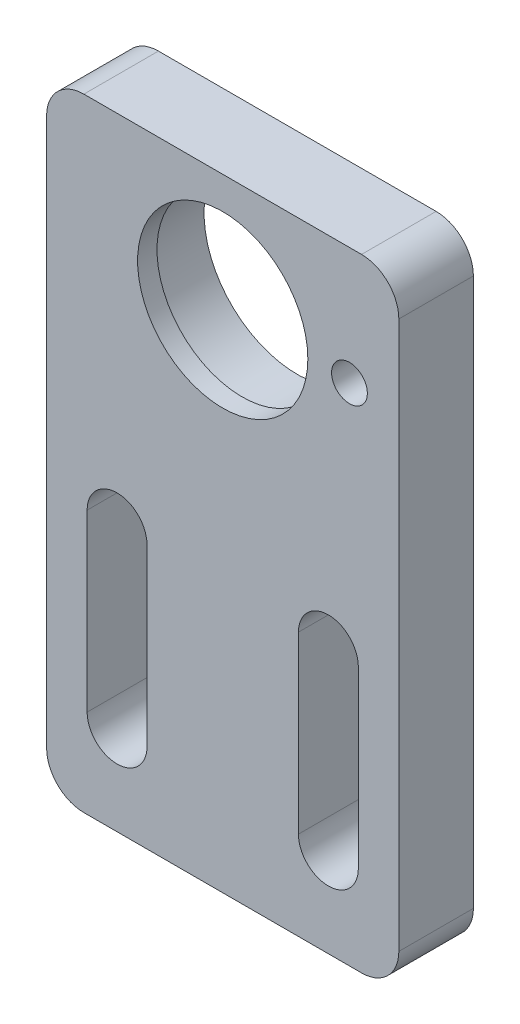
ISO-10303-21;
HEADER;
FILE_DESCRIPTION(('STEP AP214'),'2;1');
FILE_NAME('part.step','',(''),(''),'','','');
FILE_SCHEMA(('AUTOMOTIVE_DESIGN { 1 0 10303 214 1 1 1 1 }'));
ENDSEC;
DATA;
#1=APPLICATION_CONTEXT('core data for automotive mechanical design processes');
#2=APPLICATION_PROTOCOL_DEFINITION('international standard','automotive_design',2000,#1);
#3=PRODUCT_CONTEXT('',#1,'mechanical');
#4=PRODUCT('Part','Part','',(#3));
#5=PRODUCT_RELATED_PRODUCT_CATEGORY('part','',(#4));
#6=PRODUCT_DEFINITION_FORMATION('','',#4);
#7=PRODUCT_DEFINITION_CONTEXT('part definition',#1,'design');
#8=PRODUCT_DEFINITION('design','',#6,#7);
#9=PRODUCT_DEFINITION_SHAPE('','',#8);
#10=(LENGTH_UNIT() NAMED_UNIT(*) SI_UNIT(.MILLI.,.METRE.));
#11=(NAMED_UNIT(*) PLANE_ANGLE_UNIT() SI_UNIT($,.RADIAN.));
#12=(NAMED_UNIT(*) SI_UNIT($,.STERADIAN.) SOLID_ANGLE_UNIT());
#13=UNCERTAINTY_MEASURE_WITH_UNIT(LENGTH_MEASURE(1.E-05),#10,'distance_accuracy_value','');
#14=(GEOMETRIC_REPRESENTATION_CONTEXT(3) GLOBAL_UNCERTAINTY_ASSIGNED_CONTEXT((#13)) GLOBAL_UNIT_ASSIGNED_CONTEXT((#10,
#11,#12)) REPRESENTATION_CONTEXT('',''));
#15=CARTESIAN_POINT('',(0.,0.,0.));
#16=DIRECTION('',(0.,0.,1.));
#17=DIRECTION('',(1.,0.,0.));
#18=AXIS2_PLACEMENT_3D('',#15,#16,#17);
#19=CARTESIAN_POINT('',(375.68370158766,219.772136265731,0.));
#20=DIRECTION('',(0.,0.,1.));
#21=DIRECTION('',(1.,0.,0.));
#22=AXIS2_PLACEMENT_3D('',#19,#20,#21);
#23=PLANE('',#22);
#24=DIRECTION('',(-1.,0.,0.));
#25=VECTOR('',#24,1.);
#26=CARTESIAN_POINT('',(375.68370158766,293.78385422436,0.));
#27=LINE('',#26,#25);
#28=CARTESIAN_POINT('',(387.5087015876,293.78385422436,0.));
#29=VERTEX_POINT('',#28);
#30=CARTESIAN_POINT('',(363.85870158772,293.78385422436,0.));
#31=VERTEX_POINT('',#30);
#32=EDGE_CURVE('E211',#29,#31,#27,.T.);
#33=ORIENTED_EDGE('',*,*,#32,.F.);
#34=CARTESIAN_POINT('',(387.5087015876,290.60885422436,0.));
#35=DIRECTION('',(0.,0.,1.));
#36=DIRECTION('',(1.,0.,0.));
#37=AXIS2_PLACEMENT_3D('',#34,#35,#36);
#38=CIRCLE('',#37,3.17499999999998);
#39=CARTESIAN_POINT('',(390.6837015876,290.60885422436,0.));
#40=VERTEX_POINT('',#39);
#41=EDGE_CURVE('E109',#40,#29,#38,.T.);
#42=ORIENTED_EDGE('',*,*,#41,.F.);
#43=DIRECTION('',(0.,1.,0.));
#44=VECTOR('',#43,1.);
#45=CARTESIAN_POINT('',(390.6837015876,219.772136265731,0.));
#46=LINE('',#45,#44);
#47=CARTESIAN_POINT('',(390.6837015876,243.95885422254,0.));
#48=VERTEX_POINT('',#47);
#49=EDGE_CURVE('E103',#48,#40,#46,.T.);
#50=ORIENTED_EDGE('',*,*,#49,.F.);
#51=CARTESIAN_POINT('',(387.5087015876,243.95885422254,0.));
#52=DIRECTION('',(0.,0.,1.));
#53=DIRECTION('',(1.,0.,0.));
#54=AXIS2_PLACEMENT_3D('',#51,#52,#53);
#55=CIRCLE('',#54,3.175);
#56=CARTESIAN_POINT('',(387.5087015876,240.78385422254,0.));
#57=VERTEX_POINT('',#56);
#58=EDGE_CURVE('E170',#57,#48,#55,.T.);
#59=ORIENTED_EDGE('',*,*,#58,.F.);
#60=DIRECTION('',(1.,0.,0.));
#61=VECTOR('',#60,1.);
#62=CARTESIAN_POINT('',(375.68370158766,240.78385422254,0.));
#63=LINE('',#62,#61);
#64=CARTESIAN_POINT('',(363.85870158772,240.78385422254,0.));
#65=VERTEX_POINT('',#64);
#66=EDGE_CURVE('E220',#65,#57,#63,.T.);
#67=ORIENTED_EDGE('',*,*,#66,.F.);
#68=CARTESIAN_POINT('',(363.85870158772,243.95885422254,0.));
#69=DIRECTION('',(0.,0.,1.));
#70=DIRECTION('',(1.,0.,0.));
#71=AXIS2_PLACEMENT_3D('',#68,#69,#70);
#72=CIRCLE('',#71,3.17500000000003);
#73=CARTESIAN_POINT('',(360.68370158772,243.95885422254,0.));
#74=VERTEX_POINT('',#73);
#75=EDGE_CURVE('E218',#74,#65,#72,.T.);
#76=ORIENTED_EDGE('',*,*,#75,.F.);
#77=DIRECTION('',(0.,-1.,0.));
#78=VECTOR('',#77,1.);
#79=CARTESIAN_POINT('',(360.68370158772,219.772136265731,0.));
#80=LINE('',#79,#78);
#81=CARTESIAN_POINT('',(360.68370158772,290.60885422436,0.));
#82=VERTEX_POINT('',#81);
#83=EDGE_CURVE('E216',#82,#74,#80,.T.);
#84=ORIENTED_EDGE('',*,*,#83,.F.);
#85=CARTESIAN_POINT('',(363.85870158772,290.60885422436,0.));
#86=DIRECTION('',(0.,0.,1.));
#87=DIRECTION('',(1.,0.,0.));
#88=AXIS2_PLACEMENT_3D('',#85,#86,#87);
#89=CIRCLE('',#88,3.17500000000001);
#90=EDGE_CURVE('E214',#31,#82,#89,.T.);
#91=ORIENTED_EDGE('',*,*,#90,.F.);
#92=EDGE_LOOP('',(#33,#42,#50,#59,#67,#76,#84,#91));
#93=FACE_BOUND('',#92,.T.);
#94=CARTESIAN_POINT('',(366.68370158795,263.23385422466,0.));
#95=DIRECTION('',(0.,0.,1.));
#96=DIRECTION('',(1.,0.,0.));
#97=AXIS2_PLACEMENT_3D('',#94,#95,#96);
#98=CIRCLE('',#97,2.54999999904998);
#99=CARTESIAN_POINT('',(369.233701587,263.23385422466,0.));
#100=VERTEX_POINT('',#99);
#101=CARTESIAN_POINT('',(364.1337015889,263.23385422466,0.));
#102=VERTEX_POINT('',#101);
#103=EDGE_CURVE('E199',#100,#102,#98,.T.);
#104=ORIENTED_EDGE('',*,*,#103,.T.);
#105=DIRECTION('',(0.,1.,0.));
#106=VECTOR('',#105,1.);
#107=CARTESIAN_POINT('',(364.1337015889,219.772136265731,0.));
#108=LINE('',#107,#106);
#109=CARTESIAN_POINT('',(364.1337015889,248.33385422284,0.));
#110=VERTEX_POINT('',#109);
#111=EDGE_CURVE('E208',#110,#102,#108,.T.);
#112=ORIENTED_EDGE('',*,*,#111,.F.);
#113=CARTESIAN_POINT('',(366.68370158795,248.33385422284,0.));
#114=DIRECTION('',(0.,0.,1.));
#115=DIRECTION('',(1.,0.,0.));
#116=AXIS2_PLACEMENT_3D('',#113,#114,#115);
#117=CIRCLE('',#116,2.54999999904998);
#118=CARTESIAN_POINT('',(369.233701587,248.33385422284,0.));
#119=VERTEX_POINT('',#118);
#120=EDGE_CURVE('E205',#110,#119,#117,.T.);
#121=ORIENTED_EDGE('',*,*,#120,.T.);
#122=DIRECTION('',(0.,-1.,0.));
#123=VECTOR('',#122,1.);
#124=CARTESIAN_POINT('',(369.233701587,219.772136265731,0.));
#125=LINE('',#124,#123);
#126=EDGE_CURVE('E202',#100,#119,#125,.T.);
#127=ORIENTED_EDGE('',*,*,#126,.F.);
#128=EDGE_LOOP('',(#104,#112,#121,#127));
#129=FACE_BOUND('',#128,.T.);
#130=CARTESIAN_POINT('',(384.68370158864,248.33385422284,0.));
#131=DIRECTION('',(0.,0.,1.));
#132=DIRECTION('',(1.,0.,0.));
#133=AXIS2_PLACEMENT_3D('',#130,#131,#132);
#134=CIRCLE('',#133,2.55000000031999);
#135=CARTESIAN_POINT('',(382.13370158832,248.33385422284,0.));
#136=VERTEX_POINT('',#135);
#137=CARTESIAN_POINT('',(387.23370158896,248.33385422284,0.));
#138=VERTEX_POINT('',#137);
#139=EDGE_CURVE('E186',#136,#138,#134,.T.);
#140=ORIENTED_EDGE('',*,*,#139,.T.);
#141=DIRECTION('',(0.,1.,0.));
#142=VECTOR('',#141,1.);
#143=CARTESIAN_POINT('',(387.23370158896,219.772136265731,0.));
#144=LINE('',#143,#142);
#145=CARTESIAN_POINT('',(387.23370158896,263.23385422466,0.));
#146=VERTEX_POINT('',#145);
#147=EDGE_CURVE('E196',#138,#146,#144,.T.);
#148=ORIENTED_EDGE('',*,*,#147,.T.);
#149=CARTESIAN_POINT('',(384.68370158864,263.23385422466,0.));
#150=DIRECTION('',(0.,0.,1.));
#151=DIRECTION('',(1.,0.,0.));
#152=AXIS2_PLACEMENT_3D('',#149,#150,#151);
#153=CIRCLE('',#152,2.55000000031999);
#154=CARTESIAN_POINT('',(382.13370158832,263.23385422466,0.));
#155=VERTEX_POINT('',#154);
#156=EDGE_CURVE('E193',#146,#155,#153,.T.);
#157=ORIENTED_EDGE('',*,*,#156,.T.);
#158=DIRECTION('',(0.,-1.,0.));
#159=VECTOR('',#158,1.);
#160=CARTESIAN_POINT('',(382.13370158832,219.772136265731,0.));
#161=LINE('',#160,#159);
#162=EDGE_CURVE('E190',#155,#136,#161,.T.);
#163=ORIENTED_EDGE('',*,*,#162,.T.);
#164=EDGE_LOOP('',(#140,#148,#157,#163));
#165=FACE_BOUND('',#164,.T.);
#166=CARTESIAN_POINT('',(386.47870158766,283.7838542244,0.));
#167=DIRECTION('',(0.,0.,1.));
#168=DIRECTION('',(1.,0.,0.));
#169=AXIS2_PLACEMENT_3D('',#166,#167,#168);
#170=CIRCLE('',#169,1.52400000000003);
#171=CARTESIAN_POINT('',(388.00270158766,283.7838542244,0.));
#172=VERTEX_POINT('',#171);
#173=EDGE_CURVE('E183',#172,#172,#170,.T.);
#174=ORIENTED_EDGE('',*,*,#173,.T.);
#175=EDGE_LOOP('',(#174));
#176=FACE_BOUND('',#175,.T.);
#177=CARTESIAN_POINT('',(375.68370158766,283.7838542244,0.));
#178=DIRECTION('',(0.,0.,1.));
#179=DIRECTION('',(1.,0.,0.));
#180=AXIS2_PLACEMENT_3D('',#177,#178,#179);
#181=CIRCLE('',#180,7.93749999999999);
#182=CARTESIAN_POINT('',(383.62120158766,283.7838542244,0.));
#183=VERTEX_POINT('',#182);
#184=EDGE_CURVE('E349',#183,#183,#181,.T.);
#185=ORIENTED_EDGE('',*,*,#184,.T.);
#186=EDGE_LOOP('',(#185));
#187=FACE_BOUND('',#186,.T.);
#188=ADVANCED_FACE('F31',(#93,#129,#165,#176,#187),#23,.F.);
#189=CARTESIAN_POINT('',(375.68370158766,293.78385422436,6.35));
#190=DIRECTION('',(0.,-1.,0.));
#191=DIRECTION('',(0.,0.,-1.));
#192=AXIS2_PLACEMENT_3D('',#189,#190,#191);
#193=PLANE('',#192);
#194=ORIENTED_EDGE('',*,*,#32,.T.);
#195=DIRECTION('',(0.,0.,-1.));
#196=VECTOR('',#195,1.);
#197=CARTESIAN_POINT('',(363.85870158772,293.78385422436,6.35));
#198=LINE('',#197,#196);
#199=CARTESIAN_POINT('',(363.85870158772,293.78385422436,6.35));
#200=VERTEX_POINT('',#199);
#201=EDGE_CURVE('E11',#200,#31,#198,.T.);
#202=ORIENTED_EDGE('',*,*,#201,.F.);
#203=DIRECTION('',(-1.,0.,0.));
#204=VECTOR('',#203,1.);
#205=CARTESIAN_POINT('',(375.68370158766,293.78385422436,6.35));
#206=LINE('',#205,#204);
#207=CARTESIAN_POINT('',(387.5087015876,293.78385422436,6.35));
#208=VERTEX_POINT('',#207);
#209=EDGE_CURVE('E286',#208,#200,#206,.T.);
#210=ORIENTED_EDGE('',*,*,#209,.F.);
#211=DIRECTION('',(0.,0.,-1.));
#212=VECTOR('',#211,1.);
#213=CARTESIAN_POINT('',(387.5087015876,293.78385422436,6.35));
#214=LINE('',#213,#212);
#215=EDGE_CURVE('E226',#208,#29,#214,.T.);
#216=ORIENTED_EDGE('',*,*,#215,.T.);
#217=EDGE_LOOP('',(#194,#202,#210,#216));
#218=FACE_BOUND('',#217,.T.);
#219=ADVANCED_FACE('F309',(#218),#193,.F.);
#220=CARTESIAN_POINT('',(363.85870158772,290.60885422436,6.35));
#221=DIRECTION('',(0.,0.,-1.));
#222=DIRECTION('',(-1.,0.,0.));
#223=AXIS2_PLACEMENT_3D('',#220,#221,#222);
#224=CYLINDRICAL_SURFACE('',#223,3.17500000000001);
#225=ORIENTED_EDGE('',*,*,#90,.T.);
#226=DIRECTION('',(0.,0.,-1.));
#227=VECTOR('',#226,1.);
#228=CARTESIAN_POINT('',(360.68370158772,290.60885422436,6.35));
#229=LINE('',#228,#227);
#230=CARTESIAN_POINT('',(360.68370158772,290.60885422436,6.35));
#231=VERTEX_POINT('',#230);
#232=EDGE_CURVE('E41',#231,#82,#229,.T.);
#233=ORIENTED_EDGE('',*,*,#232,.F.);
#234=CARTESIAN_POINT('',(363.85870158772,290.60885422436,6.35));
#235=DIRECTION('',(0.,0.,1.));
#236=DIRECTION('',(1.,0.,0.));
#237=AXIS2_PLACEMENT_3D('',#234,#235,#236);
#238=CIRCLE('',#237,3.17500000000001);
#239=EDGE_CURVE('E288',#200,#231,#238,.T.);
#240=ORIENTED_EDGE('',*,*,#239,.F.);
#241=ORIENTED_EDGE('',*,*,#201,.T.);
#242=EDGE_LOOP('',(#225,#233,#240,#241));
#243=FACE_BOUND('',#242,.T.);
#244=ADVANCED_FACE('F329',(#243),#224,.T.);
#245=CARTESIAN_POINT('',(360.68370158772,219.772136265731,6.35));
#246=DIRECTION('',(1.,0.,0.));
#247=DIRECTION('',(0.,0.,-1.));
#248=AXIS2_PLACEMENT_3D('',#245,#246,#247);
#249=PLANE('',#248);
#250=ORIENTED_EDGE('',*,*,#83,.T.);
#251=DIRECTION('',(0.,0.,-1.));
#252=VECTOR('',#251,1.);
#253=CARTESIAN_POINT('',(360.68370158772,243.95885422254,6.35));
#254=LINE('',#253,#252);
#255=CARTESIAN_POINT('',(360.68370158772,243.95885422254,6.35));
#256=VERTEX_POINT('',#255);
#257=EDGE_CURVE('E234',#256,#74,#254,.T.);
#258=ORIENTED_EDGE('',*,*,#257,.F.);
#259=DIRECTION('',(0.,-1.,0.));
#260=VECTOR('',#259,1.);
#261=CARTESIAN_POINT('',(360.68370158772,219.772136265731,6.35));
#262=LINE('',#261,#260);
#263=EDGE_CURVE('E290',#231,#256,#262,.T.);
#264=ORIENTED_EDGE('',*,*,#263,.F.);
#265=ORIENTED_EDGE('',*,*,#232,.T.);
#266=EDGE_LOOP('',(#250,#258,#264,#265));
#267=FACE_BOUND('',#266,.T.);
#268=ADVANCED_FACE('F503',(#267),#249,.F.);
#269=CARTESIAN_POINT('',(363.85870158772,243.95885422254,6.35));
#270=DIRECTION('',(0.,0.,-1.));
#271=DIRECTION('',(-1.,0.,0.));
#272=AXIS2_PLACEMENT_3D('',#269,#270,#271);
#273=CYLINDRICAL_SURFACE('',#272,3.17500000000003);
#274=ORIENTED_EDGE('',*,*,#75,.T.);
#275=DIRECTION('',(0.,0.,-1.));
#276=VECTOR('',#275,1.);
#277=CARTESIAN_POINT('',(363.85870158772,240.78385422254,6.35));
#278=LINE('',#277,#276);
#279=CARTESIAN_POINT('',(363.85870158772,240.78385422254,6.35));
#280=VERTEX_POINT('',#279);
#281=EDGE_CURVE('E231',#280,#65,#278,.T.);
#282=ORIENTED_EDGE('',*,*,#281,.F.);
#283=CARTESIAN_POINT('',(363.85870158772,243.95885422254,6.35));
#284=DIRECTION('',(0.,0.,1.));
#285=DIRECTION('',(1.,0.,0.));
#286=AXIS2_PLACEMENT_3D('',#283,#284,#285);
#287=CIRCLE('',#286,3.17500000000003);
#288=EDGE_CURVE('E292',#256,#280,#287,.T.);
#289=ORIENTED_EDGE('',*,*,#288,.F.);
#290=ORIENTED_EDGE('',*,*,#257,.T.);
#291=EDGE_LOOP('',(#274,#282,#289,#290));
#292=FACE_BOUND('',#291,.T.);
#293=ADVANCED_FACE('F298',(#292),#273,.T.);
#294=CARTESIAN_POINT('',(375.68370158766,240.78385422254,6.35));
#295=DIRECTION('',(0.,1.,0.));
#296=DIRECTION('',(0.,0.,1.));
#297=AXIS2_PLACEMENT_3D('',#294,#295,#296);
#298=PLANE('',#297);
#299=ORIENTED_EDGE('',*,*,#66,.T.);
#300=DIRECTION('',(0.,0.,-1.));
#301=VECTOR('',#300,1.);
#302=CARTESIAN_POINT('',(387.5087015876,240.78385422254,6.35));
#303=LINE('',#302,#301);
#304=CARTESIAN_POINT('',(387.5087015876,240.78385422254,6.35));
#305=VERTEX_POINT('',#304);
#306=EDGE_CURVE('E171',#305,#57,#303,.T.);
#307=ORIENTED_EDGE('',*,*,#306,.F.);
#308=DIRECTION('',(1.,0.,0.));
#309=VECTOR('',#308,1.);
#310=CARTESIAN_POINT('',(375.68370158766,240.78385422254,6.35));
#311=LINE('',#310,#309);
#312=EDGE_CURVE('E162',#280,#305,#311,.T.);
#313=ORIENTED_EDGE('',*,*,#312,.F.);
#314=ORIENTED_EDGE('',*,*,#281,.T.);
#315=EDGE_LOOP('',(#299,#307,#313,#314));
#316=FACE_BOUND('',#315,.T.);
#317=ADVANCED_FACE('F302',(#316),#298,.F.);
#318=CARTESIAN_POINT('',(387.5087015876,243.95885422254,6.35));
#319=DIRECTION('',(0.,0.,-1.));
#320=DIRECTION('',(-1.,0.,0.));
#321=AXIS2_PLACEMENT_3D('',#318,#319,#320);
#322=CYLINDRICAL_SURFACE('',#321,3.175);
#323=ORIENTED_EDGE('',*,*,#58,.T.);
#324=DIRECTION('',(0.,0.,-1.));
#325=VECTOR('',#324,1.);
#326=CARTESIAN_POINT('',(390.6837015876,243.95885422254,6.35));
#327=LINE('',#326,#325);
#328=CARTESIAN_POINT('',(390.6837015876,243.95885422254,6.35));
#329=VERTEX_POINT('',#328);
#330=EDGE_CURVE('E167',#329,#48,#327,.T.);
#331=ORIENTED_EDGE('',*,*,#330,.F.);
#332=CARTESIAN_POINT('',(387.5087015876,243.95885422254,6.35));
#333=DIRECTION('',(0.,0.,1.));
#334=DIRECTION('',(1.,0.,0.));
#335=AXIS2_PLACEMENT_3D('',#332,#333,#334);
#336=CIRCLE('',#335,3.175);
#337=EDGE_CURVE('E155',#305,#329,#336,.T.);
#338=ORIENTED_EDGE('',*,*,#337,.F.);
#339=ORIENTED_EDGE('',*,*,#306,.T.);
#340=EDGE_LOOP('',(#323,#331,#338,#339));
#341=FACE_BOUND('',#340,.T.);
#342=ADVANCED_FACE('F168',(#341),#322,.T.);
#343=CARTESIAN_POINT('',(390.6837015876,219.772136265731,6.35));
#344=DIRECTION('',(-1.,0.,0.));
#345=DIRECTION('',(0.,0.,1.));
#346=AXIS2_PLACEMENT_3D('',#343,#344,#345);
#347=PLANE('',#346);
#348=ORIENTED_EDGE('',*,*,#49,.T.);
#349=DIRECTION('',(0.,0.,-1.));
#350=VECTOR('',#349,1.);
#351=CARTESIAN_POINT('',(390.6837015876,290.60885422436,6.35));
#352=LINE('',#351,#350);
#353=CARTESIAN_POINT('',(390.6837015876,290.60885422436,6.35));
#354=VERTEX_POINT('',#353);
#355=EDGE_CURVE('E172',#354,#40,#352,.T.);
#356=ORIENTED_EDGE('',*,*,#355,.F.);
#357=DIRECTION('',(0.,1.,0.));
#358=VECTOR('',#357,1.);
#359=CARTESIAN_POINT('',(390.6837015876,219.772136265731,6.35));
#360=LINE('',#359,#358);
#361=EDGE_CURVE('E160',#329,#354,#360,.T.);
#362=ORIENTED_EDGE('',*,*,#361,.F.);
#363=ORIENTED_EDGE('',*,*,#330,.T.);
#364=EDGE_LOOP('',(#348,#356,#362,#363));
#365=FACE_BOUND('',#364,.T.);
#366=ADVANCED_FACE('F174',(#365),#347,.F.);
#367=CARTESIAN_POINT('',(366.68370158795,263.23385422466,6.35));
#368=DIRECTION('',(0.,0.,-1.));
#369=DIRECTION('',(-1.,0.,0.));
#370=AXIS2_PLACEMENT_3D('',#367,#368,#369);
#371=CYLINDRICAL_SURFACE('',#370,2.54999999904998);
#372=ORIENTED_EDGE('',*,*,#103,.F.);
#373=DIRECTION('',(0.,0.,-1.));
#374=VECTOR('',#373,1.);
#375=CARTESIAN_POINT('',(369.233701587,263.23385422466,6.35));
#376=LINE('',#375,#374);
#377=CARTESIAN_POINT('',(369.233701587,263.23385422466,6.35));
#378=VERTEX_POINT('',#377);
#379=EDGE_CURVE('E228',#378,#100,#376,.T.);
#380=ORIENTED_EDGE('',*,*,#379,.F.);
#381=CARTESIAN_POINT('',(366.68370158795,263.23385422466,6.35));
#382=DIRECTION('',(0.,0.,1.));
#383=DIRECTION('',(1.,0.,0.));
#384=AXIS2_PLACEMENT_3D('',#381,#382,#383);
#385=CIRCLE('',#384,2.54999999904998);
#386=CARTESIAN_POINT('',(364.1337015889,263.23385422466,6.35));
#387=VERTEX_POINT('',#386);
#388=EDGE_CURVE('E273',#378,#387,#385,.T.);
#389=ORIENTED_EDGE('',*,*,#388,.T.);
#390=DIRECTION('',(0.,0.,-1.));
#391=VECTOR('',#390,1.);
#392=CARTESIAN_POINT('',(364.1337015889,263.23385422466,6.35));
#393=LINE('',#392,#391);
#394=EDGE_CURVE('E239',#387,#102,#393,.T.);
#395=ORIENTED_EDGE('',*,*,#394,.T.);
#396=EDGE_LOOP('',(#372,#380,#389,#395));
#397=FACE_BOUND('',#396,.T.);
#398=ADVANCED_FACE('F461',(#397),#371,.F.);
#399=CARTESIAN_POINT('',(369.233701587,219.772136265731,6.35));
#400=DIRECTION('',(1.,0.,0.));
#401=DIRECTION('',(0.,0.,-1.));
#402=AXIS2_PLACEMENT_3D('',#399,#400,#401);
#403=PLANE('',#402);
#404=ORIENTED_EDGE('',*,*,#126,.T.);
#405=DIRECTION('',(0.,0.,-1.));
#406=VECTOR('',#405,1.);
#407=CARTESIAN_POINT('',(369.233701587,248.33385422284,6.35));
#408=LINE('',#407,#406);
#409=CARTESIAN_POINT('',(369.233701587,248.33385422284,6.35));
#410=VERTEX_POINT('',#409);
#411=EDGE_CURVE('E243',#410,#119,#408,.T.);
#412=ORIENTED_EDGE('',*,*,#411,.F.);
#413=DIRECTION('',(0.,-1.,0.));
#414=VECTOR('',#413,1.);
#415=CARTESIAN_POINT('',(369.233701587,219.772136265731,6.35));
#416=LINE('',#415,#414);
#417=EDGE_CURVE('E276',#378,#410,#416,.T.);
#418=ORIENTED_EDGE('',*,*,#417,.F.);
#419=ORIENTED_EDGE('',*,*,#379,.T.);
#420=EDGE_LOOP('',(#404,#412,#418,#419));
#421=FACE_BOUND('',#420,.T.);
#422=ADVANCED_FACE('F451',(#421),#403,.F.);
#423=CARTESIAN_POINT('',(366.68370158795,248.33385422284,6.35));
#424=DIRECTION('',(0.,0.,-1.));
#425=DIRECTION('',(-1.,0.,0.));
#426=AXIS2_PLACEMENT_3D('',#423,#424,#425);
#427=CYLINDRICAL_SURFACE('',#426,2.54999999904998);
#428=ORIENTED_EDGE('',*,*,#120,.F.);
#429=DIRECTION('',(0.,0.,-1.));
#430=VECTOR('',#429,1.);
#431=CARTESIAN_POINT('',(364.1337015889,248.33385422284,6.35));
#432=LINE('',#431,#430);
#433=CARTESIAN_POINT('',(364.1337015889,248.33385422284,6.35));
#434=VERTEX_POINT('',#433);
#435=EDGE_CURVE('E241',#434,#110,#432,.T.);
#436=ORIENTED_EDGE('',*,*,#435,.F.);
#437=CARTESIAN_POINT('',(366.68370158795,248.33385422284,6.35));
#438=DIRECTION('',(0.,0.,1.));
#439=DIRECTION('',(1.,0.,0.));
#440=AXIS2_PLACEMENT_3D('',#437,#438,#439);
#441=CIRCLE('',#440,2.54999999904998);
#442=EDGE_CURVE('E281',#434,#410,#441,.T.);
#443=ORIENTED_EDGE('',*,*,#442,.T.);
#444=ORIENTED_EDGE('',*,*,#411,.T.);
#445=EDGE_LOOP('',(#428,#436,#443,#444));
#446=FACE_BOUND('',#445,.T.);
#447=ADVANCED_FACE('F443',(#446),#427,.F.);
#448=CARTESIAN_POINT('',(384.68370158864,248.33385422284,6.35));
#449=DIRECTION('',(0.,0.,-1.));
#450=DIRECTION('',(-1.,0.,0.));
#451=AXIS2_PLACEMENT_3D('',#448,#449,#450);
#452=CYLINDRICAL_SURFACE('',#451,2.55000000031999);
#453=ORIENTED_EDGE('',*,*,#139,.F.);
#454=DIRECTION('',(0.,0.,-1.));
#455=VECTOR('',#454,1.);
#456=CARTESIAN_POINT('',(382.13370158832,248.33385422284,6.35));
#457=LINE('',#456,#455);
#458=CARTESIAN_POINT('',(382.13370158832,248.33385422284,6.35));
#459=VERTEX_POINT('',#458);
#460=EDGE_CURVE('E35',#459,#136,#457,.T.);
#461=ORIENTED_EDGE('',*,*,#460,.F.);
#462=CARTESIAN_POINT('',(384.68370158864,248.33385422284,6.35));
#463=DIRECTION('',(0.,0.,1.));
#464=DIRECTION('',(1.,0.,0.));
#465=AXIS2_PLACEMENT_3D('',#462,#463,#464);
#466=CIRCLE('',#465,2.55000000031999);
#467=CARTESIAN_POINT('',(387.23370158896,248.33385422284,6.35));
#468=VERTEX_POINT('',#467);
#469=EDGE_CURVE('E358',#459,#468,#466,.T.);
#470=ORIENTED_EDGE('',*,*,#469,.T.);
#471=DIRECTION('',(0.,0.,-1.));
#472=VECTOR('',#471,1.);
#473=CARTESIAN_POINT('',(387.23370158896,248.33385422284,6.35));
#474=LINE('',#473,#472);
#475=EDGE_CURVE('E182',#468,#138,#474,.T.);
#476=ORIENTED_EDGE('',*,*,#475,.T.);
#477=EDGE_LOOP('',(#453,#461,#470,#476));
#478=FACE_BOUND('',#477,.T.);
#479=ADVANCED_FACE('F258',(#478),#452,.F.);
#480=CARTESIAN_POINT('',(382.13370158832,219.772136265731,6.35));
#481=DIRECTION('',(1.,0.,0.));
#482=DIRECTION('',(0.,0.,-1.));
#483=AXIS2_PLACEMENT_3D('',#480,#481,#482);
#484=PLANE('',#483);
#485=ORIENTED_EDGE('',*,*,#162,.F.);
#486=DIRECTION('',(0.,0.,-1.));
#487=VECTOR('',#486,1.);
#488=CARTESIAN_POINT('',(382.13370158832,263.23385422466,6.35));
#489=LINE('',#488,#487);
#490=CARTESIAN_POINT('',(382.13370158832,263.23385422466,6.35));
#491=VERTEX_POINT('',#490);
#492=EDGE_CURVE('E248',#491,#155,#489,.T.);
#493=ORIENTED_EDGE('',*,*,#492,.F.);
#494=DIRECTION('',(0.,-1.,0.));
#495=VECTOR('',#494,1.);
#496=CARTESIAN_POINT('',(382.13370158832,219.772136265731,6.35));
#497=LINE('',#496,#495);
#498=EDGE_CURVE('E257',#491,#459,#497,.T.);
#499=ORIENTED_EDGE('',*,*,#498,.T.);
#500=ORIENTED_EDGE('',*,*,#460,.T.);
#501=EDGE_LOOP('',(#485,#493,#499,#500));
#502=FACE_BOUND('',#501,.T.);
#503=ADVANCED_FACE('F255',(#502),#484,.T.);
#504=CARTESIAN_POINT('',(384.68370158864,263.23385422466,6.35));
#505=DIRECTION('',(0.,0.,-1.));
#506=DIRECTION('',(-1.,0.,0.));
#507=AXIS2_PLACEMENT_3D('',#504,#505,#506);
#508=CYLINDRICAL_SURFACE('',#507,2.55000000031999);
#509=ORIENTED_EDGE('',*,*,#156,.F.);
#510=DIRECTION('',(0.,0.,-1.));
#511=VECTOR('',#510,1.);
#512=CARTESIAN_POINT('',(387.23370158896,263.23385422466,6.35));
#513=LINE('',#512,#511);
#514=CARTESIAN_POINT('',(387.23370158896,263.23385422466,6.35));
#515=VERTEX_POINT('',#514);
#516=EDGE_CURVE('E247',#515,#146,#513,.T.);
#517=ORIENTED_EDGE('',*,*,#516,.F.);
#518=CARTESIAN_POINT('',(384.68370158864,263.23385422466,6.35));
#519=DIRECTION('',(0.,0.,1.));
#520=DIRECTION('',(1.,0.,0.));
#521=AXIS2_PLACEMENT_3D('',#518,#519,#520);
#522=CIRCLE('',#521,2.55000000031999);
#523=EDGE_CURVE('E264',#515,#491,#522,.T.);
#524=ORIENTED_EDGE('',*,*,#523,.T.);
#525=ORIENTED_EDGE('',*,*,#492,.T.);
#526=EDGE_LOOP('',(#509,#517,#524,#525));
#527=FACE_BOUND('',#526,.T.);
#528=ADVANCED_FACE('F262',(#527),#508,.F.);
#529=CARTESIAN_POINT('',(387.5087015876,290.60885422436,6.35));
#530=DIRECTION('',(0.,0.,-1.));
#531=DIRECTION('',(-1.,0.,0.));
#532=AXIS2_PLACEMENT_3D('',#529,#530,#531);
#533=CYLINDRICAL_SURFACE('',#532,3.17499999999998);
#534=ORIENTED_EDGE('',*,*,#41,.T.);
#535=ORIENTED_EDGE('',*,*,#215,.F.);
#536=CARTESIAN_POINT('',(387.5087015876,290.60885422436,6.35));
#537=DIRECTION('',(0.,0.,1.));
#538=DIRECTION('',(1.,0.,0.));
#539=AXIS2_PLACEMENT_3D('',#536,#537,#538);
#540=CIRCLE('',#539,3.17499999999998);
#541=EDGE_CURVE('E50',#354,#208,#540,.T.);
#542=ORIENTED_EDGE('',*,*,#541,.F.);
#543=ORIENTED_EDGE('',*,*,#355,.T.);
#544=EDGE_LOOP('',(#534,#535,#542,#543));
#545=FACE_BOUND('',#544,.T.);
#546=ADVANCED_FACE('F311',(#545),#533,.T.);
#547=CARTESIAN_POINT('',(364.1337015889,219.772136265731,6.35));
#548=DIRECTION('',(-1.,0.,0.));
#549=DIRECTION('',(0.,0.,1.));
#550=AXIS2_PLACEMENT_3D('',#547,#548,#549);
#551=PLANE('',#550);
#552=ORIENTED_EDGE('',*,*,#111,.T.);
#553=ORIENTED_EDGE('',*,*,#394,.F.);
#554=DIRECTION('',(0.,1.,0.));
#555=VECTOR('',#554,1.);
#556=CARTESIAN_POINT('',(364.1337015889,219.772136265731,6.35));
#557=LINE('',#556,#555);
#558=EDGE_CURVE('E284',#434,#387,#557,.T.);
#559=ORIENTED_EDGE('',*,*,#558,.F.);
#560=ORIENTED_EDGE('',*,*,#435,.T.);
#561=EDGE_LOOP('',(#552,#553,#559,#560));
#562=FACE_BOUND('',#561,.T.);
#563=ADVANCED_FACE('F313',(#562),#551,.F.);
#564=CARTESIAN_POINT('',(387.23370158896,219.772136265731,6.35));
#565=DIRECTION('',(-1.,0.,0.));
#566=DIRECTION('',(0.,0.,1.));
#567=AXIS2_PLACEMENT_3D('',#564,#565,#566);
#568=PLANE('',#567);
#569=ORIENTED_EDGE('',*,*,#147,.F.);
#570=ORIENTED_EDGE('',*,*,#475,.F.);
#571=DIRECTION('',(0.,1.,0.));
#572=VECTOR('',#571,1.);
#573=CARTESIAN_POINT('',(387.23370158896,219.772136265731,6.35));
#574=LINE('',#573,#572);
#575=EDGE_CURVE('E270',#468,#515,#574,.T.);
#576=ORIENTED_EDGE('',*,*,#575,.T.);
#577=ORIENTED_EDGE('',*,*,#516,.T.);
#578=EDGE_LOOP('',(#569,#570,#576,#577));
#579=FACE_BOUND('',#578,.T.);
#580=ADVANCED_FACE('F272',(#579),#568,.T.);
#581=CARTESIAN_POINT('',(386.47870158766,283.7838542244,6.35));
#582=DIRECTION('',(0.,0.,-1.));
#583=DIRECTION('',(-1.,0.,0.));
#584=AXIS2_PLACEMENT_3D('',#581,#582,#583);
#585=CYLINDRICAL_SURFACE('',#584,1.52400000000003);
#586=CARTESIAN_POINT('',(386.47870158766,283.7838542244,6.35));
#587=DIRECTION('',(0.,0.,1.));
#588=DIRECTION('',(1.,0.,0.));
#589=AXIS2_PLACEMENT_3D('',#586,#587,#588);
#590=CIRCLE('',#589,1.52400000000003);
#591=CARTESIAN_POINT('',(388.00270158766,283.7838542244,6.35));
#592=VERTEX_POINT('',#591);
#593=EDGE_CURVE('E225',#592,#592,#590,.T.);
#594=ORIENTED_EDGE('',*,*,#593,.T.);
#595=EDGE_LOOP('',(#594));
#596=FACE_BOUND('',#595,.T.);
#597=ORIENTED_EDGE('',*,*,#173,.F.);
#598=EDGE_LOOP('',(#597));
#599=FACE_BOUND('',#598,.T.);
#600=ADVANCED_FACE('F33',(#596,#599),#585,.F.);
#601=CARTESIAN_POINT('',(375.68370158766,283.7838542244,6.35));
#602=DIRECTION('',(0.,0.,-1.));
#603=DIRECTION('',(-1.,0.,0.));
#604=AXIS2_PLACEMENT_3D('',#601,#602,#603);
#605=CYLINDRICAL_SURFACE('',#604,7.25000000086001);
#606=CARTESIAN_POINT('',(375.68370158766,283.7838542244,4.699));
#607=DIRECTION('',(0.,0.,1.));
#608=DIRECTION('',(1.,0.,0.));
#609=AXIS2_PLACEMENT_3D('',#606,#607,#608);
#610=CIRCLE('',#609,7.25000000086001);
#611=CARTESIAN_POINT('',(382.93370158852,283.7838542244,4.699));
#612=VERTEX_POINT('',#611);
#613=EDGE_CURVE('E346',#612,#612,#610,.T.);
#614=ORIENTED_EDGE('',*,*,#613,.F.);
#615=EDGE_LOOP('',(#614));
#616=FACE_BOUND('',#615,.T.);
#617=CARTESIAN_POINT('',(375.68370158766,283.7838542244,6.35));
#618=DIRECTION('',(0.,0.,1.));
#619=DIRECTION('',(1.,0.,0.));
#620=AXIS2_PLACEMENT_3D('',#617,#618,#619);
#621=CIRCLE('',#620,7.25000000086001);
#622=CARTESIAN_POINT('',(382.93370158852,283.7838542244,6.35));
#623=VERTEX_POINT('',#622);
#624=EDGE_CURVE('E176',#623,#623,#621,.T.);
#625=ORIENTED_EDGE('',*,*,#624,.T.);
#626=EDGE_LOOP('',(#625));
#627=FACE_BOUND('',#626,.T.);
#628=ADVANCED_FACE('F333',(#616,#627),#605,.F.);
#629=CARTESIAN_POINT('',(375.68370158766,219.772136265731,6.35));
#630=DIRECTION('',(0.,0.,1.));
#631=DIRECTION('',(1.,0.,0.));
#632=AXIS2_PLACEMENT_3D('',#629,#630,#631);
#633=PLANE('',#632);
#634=ORIENTED_EDGE('',*,*,#593,.F.);
#635=EDGE_LOOP('',(#634));
#636=FACE_BOUND('',#635,.T.);
#637=ORIENTED_EDGE('',*,*,#469,.F.);
#638=ORIENTED_EDGE('',*,*,#498,.F.);
#639=ORIENTED_EDGE('',*,*,#523,.F.);
#640=ORIENTED_EDGE('',*,*,#575,.F.);
#641=EDGE_LOOP('',(#637,#638,#639,#640));
#642=FACE_BOUND('',#641,.T.);
#643=ORIENTED_EDGE('',*,*,#388,.F.);
#644=ORIENTED_EDGE('',*,*,#417,.T.);
#645=ORIENTED_EDGE('',*,*,#442,.F.);
#646=ORIENTED_EDGE('',*,*,#558,.T.);
#647=EDGE_LOOP('',(#643,#644,#645,#646));
#648=FACE_BOUND('',#647,.T.);
#649=ORIENTED_EDGE('',*,*,#209,.T.);
#650=ORIENTED_EDGE('',*,*,#239,.T.);
#651=ORIENTED_EDGE('',*,*,#263,.T.);
#652=ORIENTED_EDGE('',*,*,#288,.T.);
#653=ORIENTED_EDGE('',*,*,#312,.T.);
#654=ORIENTED_EDGE('',*,*,#337,.T.);
#655=ORIENTED_EDGE('',*,*,#361,.T.);
#656=ORIENTED_EDGE('',*,*,#541,.T.);
#657=EDGE_LOOP('',(#649,#650,#651,#652,#653,#654,#655,#656));
#658=FACE_BOUND('',#657,.T.);
#659=ORIENTED_EDGE('',*,*,#624,.F.);
#660=EDGE_LOOP('',(#659));
#661=FACE_BOUND('',#660,.T.);
#662=ADVANCED_FACE('F157',(#636,#642,#648,#658,#661),#633,.T.);
#663=CARTESIAN_POINT('',(375.68370158766,283.7838542244,4.699));
#664=DIRECTION('',(0.,0.,-1.));
#665=DIRECTION('',(-1.,0.,0.));
#666=AXIS2_PLACEMENT_3D('',#663,#664,#665);
#667=CYLINDRICAL_SURFACE('',#666,7.93749999999999);
#668=CARTESIAN_POINT('',(375.68370158766,283.7838542244,4.699));
#669=DIRECTION('',(0.,0.,1.));
#670=DIRECTION('',(1.,0.,0.));
#671=AXIS2_PLACEMENT_3D('',#668,#669,#670);
#672=CIRCLE('',#671,7.93749999999999);
#673=CARTESIAN_POINT('',(383.62120158766,283.7838542244,4.699));
#674=VERTEX_POINT('',#673);
#675=EDGE_CURVE('E187',#674,#674,#672,.T.);
#676=ORIENTED_EDGE('',*,*,#675,.T.);
#677=EDGE_LOOP('',(#676));
#678=FACE_BOUND('',#677,.T.);
#679=ORIENTED_EDGE('',*,*,#184,.F.);
#680=EDGE_LOOP('',(#679));
#681=FACE_BOUND('',#680,.T.);
#682=ADVANCED_FACE('F340',(#678,#681),#667,.F.);
#683=CARTESIAN_POINT('',(375.68370158766,219.772136265731,4.699));
#684=DIRECTION('',(0.,0.,1.));
#685=DIRECTION('',(1.,0.,0.));
#686=AXIS2_PLACEMENT_3D('',#683,#684,#685);
#687=PLANE('',#686);
#688=ORIENTED_EDGE('',*,*,#613,.T.);
#689=EDGE_LOOP('',(#688));
#690=FACE_BOUND('',#689,.T.);
#691=ORIENTED_EDGE('',*,*,#675,.F.);
#692=EDGE_LOOP('',(#691));
#693=FACE_BOUND('',#692,.T.);
#694=ADVANCED_FACE('F366',(#690,#693),#687,.F.);
#695=CLOSED_SHELL('',(#188,#219,#244,#268,#293,#317,#342,#366,#398,#422,#447,#479,#503,#528,
#546,#563,#580,#600,#628,#662,#682,#694));
#696=MANIFOLD_SOLID_BREP('B2',#695);
#697=ADVANCED_BREP_SHAPE_REPRESENTATION('',(#18,#696),#14);
#698=SHAPE_DEFINITION_REPRESENTATION(#9,#697);
ENDSEC;
END-ISO-10303-21;
